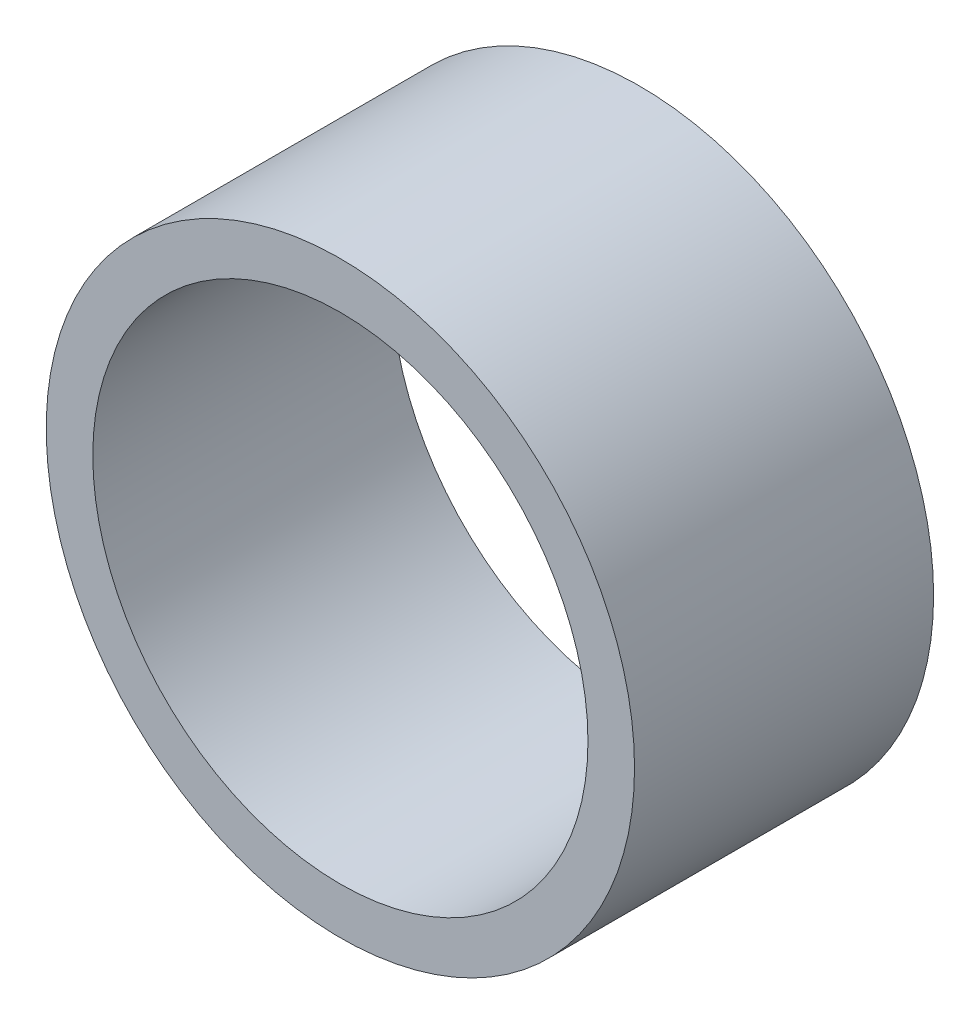
ISO-10303-21;
HEADER;
FILE_DESCRIPTION(('STEP AP214'),'2;1');
FILE_NAME('part.step','',(''),(''),'','','');
FILE_SCHEMA(('AUTOMOTIVE_DESIGN { 1 0 10303 214 1 1 1 1 }'));
ENDSEC;
DATA;
#1=APPLICATION_CONTEXT('core data for automotive mechanical design processes');
#2=APPLICATION_PROTOCOL_DEFINITION('international standard','automotive_design',2000,#1);
#3=PRODUCT_CONTEXT('',#1,'mechanical');
#4=PRODUCT('Part','Part','',(#3));
#5=PRODUCT_RELATED_PRODUCT_CATEGORY('part','',(#4));
#6=PRODUCT_DEFINITION_FORMATION('','',#4);
#7=PRODUCT_DEFINITION_CONTEXT('part definition',#1,'design');
#8=PRODUCT_DEFINITION('design','',#6,#7);
#9=PRODUCT_DEFINITION_SHAPE('','',#8);
#10=(LENGTH_UNIT() NAMED_UNIT(*) SI_UNIT(.MILLI.,.METRE.));
#11=(NAMED_UNIT(*) PLANE_ANGLE_UNIT() SI_UNIT($,.RADIAN.));
#12=(NAMED_UNIT(*) SI_UNIT($,.STERADIAN.) SOLID_ANGLE_UNIT());
#13=UNCERTAINTY_MEASURE_WITH_UNIT(LENGTH_MEASURE(1.E-05),#10,'distance_accuracy_value','');
#14=(GEOMETRIC_REPRESENTATION_CONTEXT(3) GLOBAL_UNCERTAINTY_ASSIGNED_CONTEXT((#13)) GLOBAL_UNIT_ASSIGNED_CONTEXT((#10,
#11,#12)) REPRESENTATION_CONTEXT('',''));
#15=CARTESIAN_POINT('',(0.,0.,0.));
#16=DIRECTION('',(0.,0.,1.));
#17=DIRECTION('',(1.,0.,0.));
#18=AXIS2_PLACEMENT_3D('',#15,#16,#17);
#19=CARTESIAN_POINT('',(0.,0.,9.15));
#20=DIRECTION('',(0.,0.,1.));
#21=DIRECTION('',(1.,0.,0.));
#22=AXIS2_PLACEMENT_3D('',#19,#20,#21);
#23=PLANE('',#22);
#24=CARTESIAN_POINT('',(0.,0.,9.15));
#25=DIRECTION('',(0.,0.,1.));
#26=DIRECTION('',(1.,0.,0.));
#27=AXIS2_PLACEMENT_3D('',#24,#25,#26);
#28=CIRCLE('',#27,18.);
#29=CARTESIAN_POINT('',(18.,0.,9.15));
#30=VERTEX_POINT('',#29);
#31=EDGE_CURVE('E11',#30,#30,#28,.T.);
#32=ORIENTED_EDGE('',*,*,#31,.T.);
#33=EDGE_LOOP('',(#32));
#34=FACE_BOUND('',#33,.T.);
#35=CARTESIAN_POINT('',(0.,0.,9.15));
#36=DIRECTION('',(0.,0.,1.));
#37=DIRECTION('',(1.,0.,0.));
#38=AXIS2_PLACEMENT_3D('',#35,#36,#37);
#39=CIRCLE('',#38,15.15);
#40=CARTESIAN_POINT('',(15.15,0.,9.15));
#41=VERTEX_POINT('',#40);
#42=EDGE_CURVE('E53',#41,#41,#39,.T.);
#43=ORIENTED_EDGE('',*,*,#42,.F.);
#44=EDGE_LOOP('',(#43));
#45=FACE_BOUND('',#44,.T.);
#46=ADVANCED_FACE('F43',(#34,#45),#23,.T.);
#47=CARTESIAN_POINT('',(0.,0.,-9.15));
#48=DIRECTION('',(0.,0.,1.));
#49=DIRECTION('',(1.,0.,0.));
#50=AXIS2_PLACEMENT_3D('',#47,#48,#49);
#51=PLANE('',#50);
#52=CARTESIAN_POINT('',(0.,0.,-9.15));
#53=DIRECTION('',(0.,0.,1.));
#54=DIRECTION('',(1.,0.,0.));
#55=AXIS2_PLACEMENT_3D('',#52,#53,#54);
#56=CIRCLE('',#55,18.);
#57=CARTESIAN_POINT('',(18.,0.,-9.15));
#58=VERTEX_POINT('',#57);
#59=EDGE_CURVE('E50',#58,#58,#56,.T.);
#60=ORIENTED_EDGE('',*,*,#59,.F.);
#61=EDGE_LOOP('',(#60));
#62=FACE_BOUND('',#61,.T.);
#63=CARTESIAN_POINT('',(0.,0.,-9.15));
#64=DIRECTION('',(0.,0.,1.));
#65=DIRECTION('',(1.,0.,0.));
#66=AXIS2_PLACEMENT_3D('',#63,#64,#65);
#67=CIRCLE('',#66,15.15);
#68=CARTESIAN_POINT('',(15.15,0.,-9.15));
#69=VERTEX_POINT('',#68);
#70=EDGE_CURVE('E57',#69,#69,#67,.T.);
#71=ORIENTED_EDGE('',*,*,#70,.T.);
#72=EDGE_LOOP('',(#71));
#73=FACE_BOUND('',#72,.T.);
#74=ADVANCED_FACE('F67',(#62,#73),#51,.F.);
#75=CARTESIAN_POINT('',(0.,0.,9.15));
#76=DIRECTION('',(0.,0.,-1.));
#77=DIRECTION('',(-1.,0.,0.));
#78=AXIS2_PLACEMENT_3D('',#75,#76,#77);
#79=CYLINDRICAL_SURFACE('',#78,18.);
#80=ORIENTED_EDGE('',*,*,#31,.F.);
#81=EDGE_LOOP('',(#80));
#82=FACE_BOUND('',#81,.T.);
#83=ORIENTED_EDGE('',*,*,#59,.T.);
#84=EDGE_LOOP('',(#83));
#85=FACE_BOUND('',#84,.T.);
#86=ADVANCED_FACE('F44',(#82,#85),#79,.T.);
#87=CARTESIAN_POINT('',(0.,0.,9.15));
#88=DIRECTION('',(0.,0.,-1.));
#89=DIRECTION('',(-1.,0.,0.));
#90=AXIS2_PLACEMENT_3D('',#87,#88,#89);
#91=CYLINDRICAL_SURFACE('',#90,15.15);
#92=ORIENTED_EDGE('',*,*,#42,.T.);
#93=EDGE_LOOP('',(#92));
#94=FACE_BOUND('',#93,.T.);
#95=ORIENTED_EDGE('',*,*,#70,.F.);
#96=EDGE_LOOP('',(#95));
#97=FACE_BOUND('',#96,.T.);
#98=ADVANCED_FACE('F62',(#94,#97),#91,.F.);
#99=CLOSED_SHELL('',(#46,#74,#86,#98));
#100=MANIFOLD_SOLID_BREP('B2',#99);
#101=ADVANCED_BREP_SHAPE_REPRESENTATION('',(#18,#100),#14);
#102=SHAPE_DEFINITION_REPRESENTATION(#9,#101);
ENDSEC;
END-ISO-10303-21;
